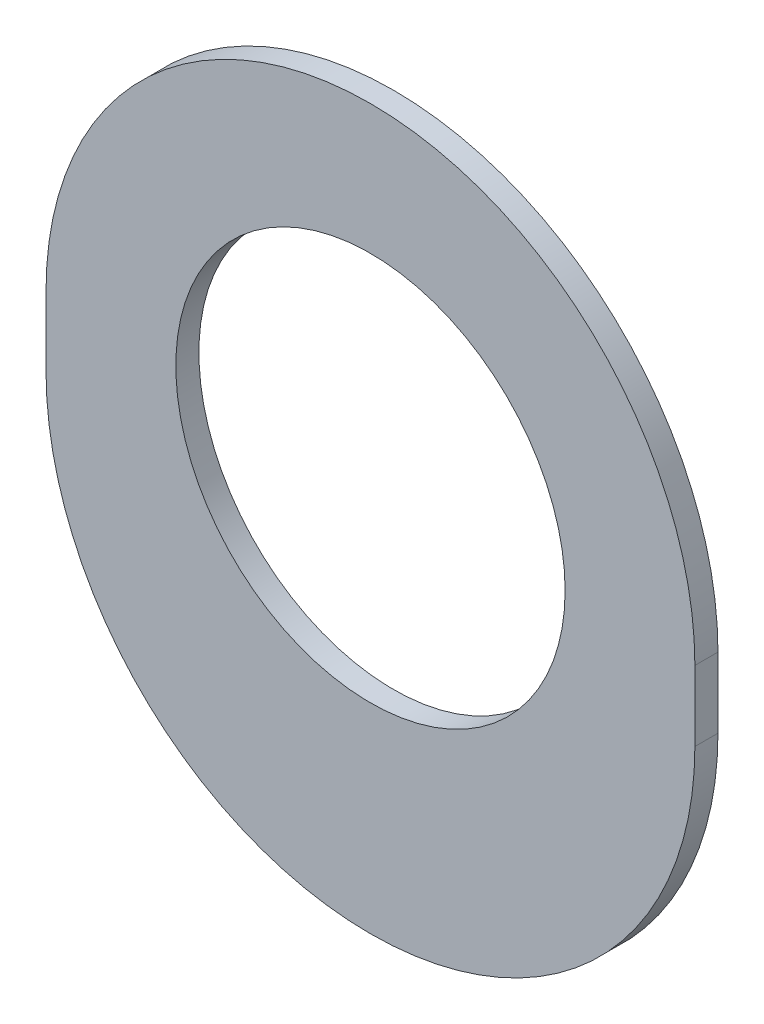
ISO-10303-21;
HEADER;
FILE_DESCRIPTION(('STEP AP214'),'2;1');
FILE_NAME('part.step','',(''),(''),'','','');
FILE_SCHEMA(('AUTOMOTIVE_DESIGN { 1 0 10303 214 1 1 1 1 }'));
ENDSEC;
DATA;
#1=APPLICATION_CONTEXT('core data for automotive mechanical design processes');
#2=APPLICATION_PROTOCOL_DEFINITION('international standard','automotive_design',2000,#1);
#3=PRODUCT_CONTEXT('',#1,'mechanical');
#4=PRODUCT('Part','Part','',(#3));
#5=PRODUCT_RELATED_PRODUCT_CATEGORY('part','',(#4));
#6=PRODUCT_DEFINITION_FORMATION('','',#4);
#7=PRODUCT_DEFINITION_CONTEXT('part definition',#1,'design');
#8=PRODUCT_DEFINITION('design','',#6,#7);
#9=PRODUCT_DEFINITION_SHAPE('','',#8);
#10=(LENGTH_UNIT() NAMED_UNIT(*) SI_UNIT(.MILLI.,.METRE.));
#11=(NAMED_UNIT(*) PLANE_ANGLE_UNIT() SI_UNIT($,.RADIAN.));
#12=(NAMED_UNIT(*) SI_UNIT($,.STERADIAN.) SOLID_ANGLE_UNIT());
#13=UNCERTAINTY_MEASURE_WITH_UNIT(LENGTH_MEASURE(1.E-05),#10,'distance_accuracy_value','');
#14=(GEOMETRIC_REPRESENTATION_CONTEXT(3) GLOBAL_UNCERTAINTY_ASSIGNED_CONTEXT((#13)) GLOBAL_UNIT_ASSIGNED_CONTEXT((#10,
#11,#12)) REPRESENTATION_CONTEXT('',''));
#15=CARTESIAN_POINT('',(0.,0.,0.));
#16=DIRECTION('',(0.,0.,1.));
#17=DIRECTION('',(1.,0.,0.));
#18=AXIS2_PLACEMENT_3D('',#15,#16,#17);
#19=CARTESIAN_POINT('',(81.3599846,95.89177164,0.));
#20=DIRECTION('',(-1.,0.,0.));
#21=DIRECTION('',(0.,1.,0.));
#22=AXIS2_PLACEMENT_3D('',#19,#20,#21);
#23=PLANE('',#22);
#24=DIRECTION('',(0.,1.,0.));
#25=VECTOR('',#24,1.);
#26=CARTESIAN_POINT('',(81.3599846,95.89177164,0.03556));
#27=LINE('',#26,#25);
#28=CARTESIAN_POINT('',(81.3599846,95.89177164,0.03556));
#29=VERTEX_POINT('',#28);
#30=CARTESIAN_POINT('',(81.3599846,96.0000112,0.03556));
#31=VERTEX_POINT('',#30);
#32=EDGE_CURVE('E11',#29,#31,#27,.T.);
#33=ORIENTED_EDGE('',*,*,#32,.F.);
#34=DIRECTION('',(0.,0.,1.));
#35=VECTOR('',#34,1.);
#36=CARTESIAN_POINT('',(81.3599846,95.89177164,0.));
#37=LINE('',#36,#35);
#38=CARTESIAN_POINT('',(81.3599846,95.89177164,0.));
#39=VERTEX_POINT('',#38);
#40=EDGE_CURVE('E24',#39,#29,#37,.T.);
#41=ORIENTED_EDGE('',*,*,#40,.F.);
#42=DIRECTION('',(0.,1.,0.));
#43=VECTOR('',#42,1.);
#44=CARTESIAN_POINT('',(81.3599846,95.89177164,0.));
#45=LINE('',#44,#43);
#46=CARTESIAN_POINT('',(81.3599846,96.0000112,0.));
#47=VERTEX_POINT('',#46);
#48=EDGE_CURVE('E96',#39,#47,#45,.T.);
#49=ORIENTED_EDGE('',*,*,#48,.T.);
#50=DIRECTION('',(0.,0.,1.));
#51=VECTOR('',#50,1.);
#52=CARTESIAN_POINT('',(81.3599846,96.0000112,0.));
#53=LINE('',#52,#51);
#54=EDGE_CURVE('E37',#47,#31,#53,.T.);
#55=ORIENTED_EDGE('',*,*,#54,.T.);
#56=EDGE_LOOP('',(#33,#41,#49,#55));
#57=FACE_BOUND('',#56,.T.);
#58=ADVANCED_FACE('F17',(#57),#23,.F.);
#59=CARTESIAN_POINT('',(80.8599856,95.89177164,0.));
#60=DIRECTION('',(0.,0.,-1.));
#61=DIRECTION('',(-1.,0.,0.));
#62=AXIS2_PLACEMENT_3D('',#59,#60,#61);
#63=CYLINDRICAL_SURFACE('',#62,0.499999000000007);
#64=CARTESIAN_POINT('',(80.8599856,95.89177164,0.03556));
#65=DIRECTION('',(0.,0.,1.));
#66=DIRECTION('',(-1.,0.,0.));
#67=AXIS2_PLACEMENT_3D('',#64,#65,#66);
#68=CIRCLE('',#67,0.499999000000007);
#69=CARTESIAN_POINT('',(80.3599866,95.89177164,0.03556));
#70=VERTEX_POINT('',#69);
#71=EDGE_CURVE('E92',#70,#29,#68,.T.);
#72=ORIENTED_EDGE('',*,*,#71,.F.);
#73=DIRECTION('',(0.,0.,1.));
#74=VECTOR('',#73,1.);
#75=CARTESIAN_POINT('',(80.3599866,95.89177164,0.));
#76=LINE('',#75,#74);
#77=CARTESIAN_POINT('',(80.3599866,95.89177164,0.));
#78=VERTEX_POINT('',#77);
#79=EDGE_CURVE('E90',#78,#70,#76,.T.);
#80=ORIENTED_EDGE('',*,*,#79,.F.);
#81=CARTESIAN_POINT('',(80.8599856,95.89177164,0.));
#82=DIRECTION('',(0.,0.,1.));
#83=DIRECTION('',(-1.,0.,0.));
#84=AXIS2_PLACEMENT_3D('',#81,#82,#83);
#85=CIRCLE('',#84,0.499999000000007);
#86=EDGE_CURVE('E88',#78,#39,#85,.T.);
#87=ORIENTED_EDGE('',*,*,#86,.T.);
#88=ORIENTED_EDGE('',*,*,#40,.T.);
#89=EDGE_LOOP('',(#72,#80,#87,#88));
#90=FACE_BOUND('',#89,.T.);
#91=ADVANCED_FACE('F111',(#90),#63,.T.);
#92=CARTESIAN_POINT('',(80.8599856,96.0000112,0.));
#93=DIRECTION('',(0.,0.,-1.));
#94=DIRECTION('',(1.,0.,0.));
#95=AXIS2_PLACEMENT_3D('',#92,#93,#94);
#96=CYLINDRICAL_SURFACE('',#95,0.499999000000007);
#97=CARTESIAN_POINT('',(80.8599856,96.0000112,0.03556));
#98=DIRECTION('',(0.,0.,1.));
#99=DIRECTION('',(1.,0.,0.));
#100=AXIS2_PLACEMENT_3D('',#97,#98,#99);
#101=CIRCLE('',#100,0.499999000000007);
#102=CARTESIAN_POINT('',(80.3599866,96.0000112,0.03556));
#103=VERTEX_POINT('',#102);
#104=EDGE_CURVE('E85',#31,#103,#101,.T.);
#105=ORIENTED_EDGE('',*,*,#104,.F.);
#106=ORIENTED_EDGE('',*,*,#54,.F.);
#107=CARTESIAN_POINT('',(80.8599856,96.0000112,0.));
#108=DIRECTION('',(0.,0.,1.));
#109=DIRECTION('',(1.,0.,0.));
#110=AXIS2_PLACEMENT_3D('',#107,#108,#109);
#111=CIRCLE('',#110,0.499999000000007);
#112=CARTESIAN_POINT('',(80.3599866,96.0000112,0.));
#113=VERTEX_POINT('',#112);
#114=EDGE_CURVE('E82',#47,#113,#111,.T.);
#115=ORIENTED_EDGE('',*,*,#114,.T.);
#116=DIRECTION('',(0.,0.,1.));
#117=VECTOR('',#116,1.);
#118=CARTESIAN_POINT('',(80.3599866,96.0000112,0.));
#119=LINE('',#118,#117);
#120=EDGE_CURVE('E80',#113,#103,#119,.T.);
#121=ORIENTED_EDGE('',*,*,#120,.T.);
#122=EDGE_LOOP('',(#105,#106,#115,#121));
#123=FACE_BOUND('',#122,.T.);
#124=ADVANCED_FACE('F104',(#123),#96,.T.);
#125=CARTESIAN_POINT('',(80.3599866,96.0000112,0.));
#126=DIRECTION('',(1.,0.,0.));
#127=DIRECTION('',(0.,-1.,0.));
#128=AXIS2_PLACEMENT_3D('',#125,#126,#127);
#129=PLANE('',#128);
#130=DIRECTION('',(0.,-1.,0.));
#131=VECTOR('',#130,1.);
#132=CARTESIAN_POINT('',(80.3599866,96.0000112,0.03556));
#133=LINE('',#132,#131);
#134=EDGE_CURVE('E77',#103,#70,#133,.T.);
#135=ORIENTED_EDGE('',*,*,#134,.F.);
#136=ORIENTED_EDGE('',*,*,#120,.F.);
#137=DIRECTION('',(0.,-1.,0.));
#138=VECTOR('',#137,1.);
#139=CARTESIAN_POINT('',(80.3599866,96.0000112,0.));
#140=LINE('',#139,#138);
#141=EDGE_CURVE('E68',#113,#78,#140,.T.);
#142=ORIENTED_EDGE('',*,*,#141,.T.);
#143=ORIENTED_EDGE('',*,*,#79,.T.);
#144=EDGE_LOOP('',(#135,#136,#142,#143));
#145=FACE_BOUND('',#144,.T.);
#146=ADVANCED_FACE('F110',(#145),#129,.F.);
#147=CARTESIAN_POINT('',(80.8599856,96.0000112,0.));
#148=DIRECTION('',(0.,0.,-1.));
#149=DIRECTION('',(1.,0.,0.));
#150=AXIS2_PLACEMENT_3D('',#147,#148,#149);
#151=CYLINDRICAL_SURFACE('',#150,0.2999994);
#152=DIRECTION('',(0.,0.,1.));
#153=VECTOR('',#152,1.);
#154=CARTESIAN_POINT('',(81.159985,96.0000112,0.));
#155=LINE('',#154,#153);
#156=CARTESIAN_POINT('',(81.159985,96.0000112,0.));
#157=VERTEX_POINT('',#156);
#158=CARTESIAN_POINT('',(81.159985,96.0000112,0.03556));
#159=VERTEX_POINT('',#158);
#160=EDGE_CURVE('E62',#157,#159,#155,.T.);
#161=ORIENTED_EDGE('',*,*,#160,.T.);
#162=CARTESIAN_POINT('',(80.8599856,96.0000112,0.03556));
#163=DIRECTION('',(0.,0.,1.));
#164=DIRECTION('',(1.,0.,0.));
#165=AXIS2_PLACEMENT_3D('',#162,#163,#164);
#166=CIRCLE('',#165,0.2999994);
#167=EDGE_CURVE('E67',#159,#159,#166,.T.);
#168=ORIENTED_EDGE('',*,*,#167,.T.);
#169=ORIENTED_EDGE('',*,*,#160,.F.);
#170=CARTESIAN_POINT('',(80.8599856,96.0000112,0.));
#171=DIRECTION('',(0.,0.,1.));
#172=DIRECTION('',(1.,0.,0.));
#173=AXIS2_PLACEMENT_3D('',#170,#171,#172);
#174=CIRCLE('',#173,0.2999994);
#175=EDGE_CURVE('E65',#157,#157,#174,.T.);
#176=ORIENTED_EDGE('',*,*,#175,.F.);
#177=EDGE_LOOP('',(#161,#168,#169,#176));
#178=FACE_BOUND('',#177,.T.);
#179=ADVANCED_FACE('F64',(#178),#151,.F.);
#180=CARTESIAN_POINT('',(81.3599846,95.89177164,0.));
#181=DIRECTION('',(0.,0.,-1.));
#182=DIRECTION('',(-1.,0.,0.));
#183=AXIS2_PLACEMENT_3D('',#180,#181,#182);
#184=PLANE('',#183);
#185=ORIENTED_EDGE('',*,*,#48,.F.);
#186=ORIENTED_EDGE('',*,*,#86,.F.);
#187=ORIENTED_EDGE('',*,*,#141,.F.);
#188=ORIENTED_EDGE('',*,*,#114,.F.);
#189=EDGE_LOOP('',(#185,#186,#187,#188));
#190=FACE_BOUND('',#189,.T.);
#191=ORIENTED_EDGE('',*,*,#175,.T.);
#192=EDGE_LOOP('',(#191));
#193=FACE_BOUND('',#192,.T.);
#194=ADVANCED_FACE('F71',(#190,#193),#184,.T.);
#195=CARTESIAN_POINT('',(81.3599846,95.89177164,0.03556));
#196=DIRECTION('',(0.,0.,-1.));
#197=DIRECTION('',(-1.,0.,0.));
#198=AXIS2_PLACEMENT_3D('',#195,#196,#197);
#199=PLANE('',#198);
#200=ORIENTED_EDGE('',*,*,#134,.T.);
#201=ORIENTED_EDGE('',*,*,#71,.T.);
#202=ORIENTED_EDGE('',*,*,#32,.T.);
#203=ORIENTED_EDGE('',*,*,#104,.T.);
#204=EDGE_LOOP('',(#200,#201,#202,#203));
#205=FACE_BOUND('',#204,.T.);
#206=ORIENTED_EDGE('',*,*,#167,.F.);
#207=EDGE_LOOP('',(#206));
#208=FACE_BOUND('',#207,.T.);
#209=ADVANCED_FACE('F107',(#205,#208),#199,.F.);
#210=CLOSED_SHELL('',(#58,#91,#124,#146,#179,#194,#209));
#211=MANIFOLD_SOLID_BREP('B1',#210);
#212=ADVANCED_BREP_SHAPE_REPRESENTATION('',(#18,#211),#14);
#213=SHAPE_DEFINITION_REPRESENTATION(#9,#212);
ENDSEC;
END-ISO-10303-21;
